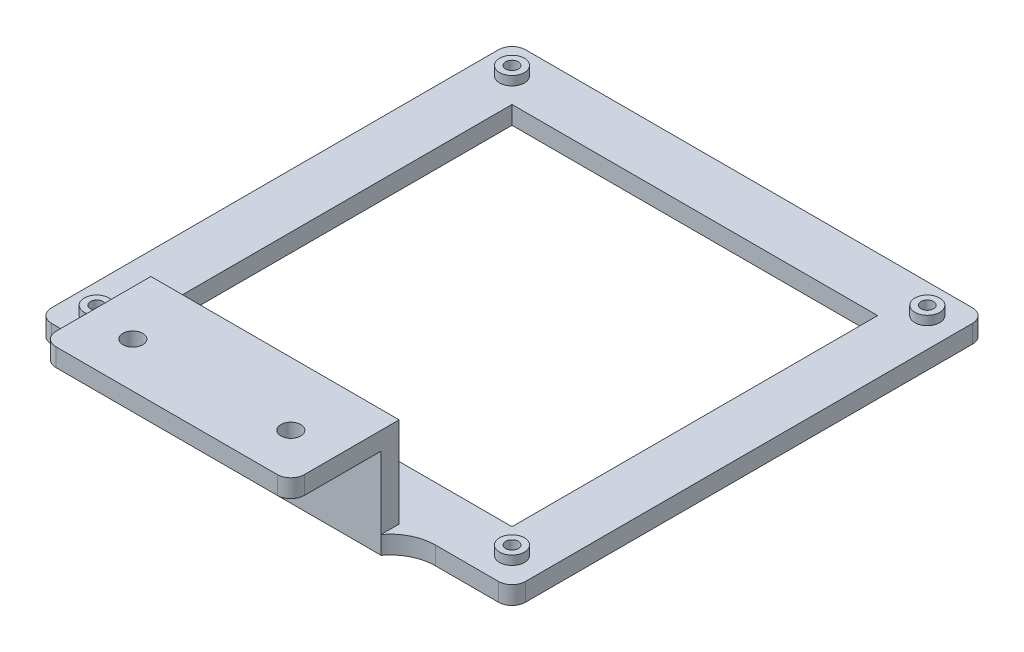
ISO-10303-21;
HEADER;
FILE_DESCRIPTION(('STEP AP214'),'2;1');
FILE_NAME('part.step','',(''),(''),'','','');
FILE_SCHEMA(('AUTOMOTIVE_DESIGN { 1 0 10303 214 1 1 1 1 }'));
ENDSEC;
DATA;
#1=APPLICATION_CONTEXT('core data for automotive mechanical design processes');
#2=APPLICATION_PROTOCOL_DEFINITION('international standard','automotive_design',2000,#1);
#3=PRODUCT_CONTEXT('',#1,'mechanical');
#4=PRODUCT('Part','Part','',(#3));
#5=PRODUCT_RELATED_PRODUCT_CATEGORY('part','',(#4));
#6=PRODUCT_DEFINITION_FORMATION('','',#4);
#7=PRODUCT_DEFINITION_CONTEXT('part definition',#1,'design');
#8=PRODUCT_DEFINITION('design','',#6,#7);
#9=PRODUCT_DEFINITION_SHAPE('','',#8);
#10=(LENGTH_UNIT() NAMED_UNIT(*) SI_UNIT(.MILLI.,.METRE.));
#11=(NAMED_UNIT(*) PLANE_ANGLE_UNIT() SI_UNIT($,.RADIAN.));
#12=(NAMED_UNIT(*) SI_UNIT($,.STERADIAN.) SOLID_ANGLE_UNIT());
#13=UNCERTAINTY_MEASURE_WITH_UNIT(LENGTH_MEASURE(1.E-05),#10,'distance_accuracy_value','');
#14=(GEOMETRIC_REPRESENTATION_CONTEXT(3) GLOBAL_UNCERTAINTY_ASSIGNED_CONTEXT((#13)) GLOBAL_UNIT_ASSIGNED_CONTEXT((#10,
#11,#12)) REPRESENTATION_CONTEXT('',''));
#15=CARTESIAN_POINT('',(0.,0.,0.));
#16=DIRECTION('',(0.,0.,1.));
#17=DIRECTION('',(1.,0.,0.));
#18=AXIS2_PLACEMENT_3D('',#15,#16,#17);
#19=CARTESIAN_POINT('',(0.,4.,52.5));
#20=DIRECTION('',(0.,0.,-1.));
#21=DIRECTION('',(-1.,0.,0.));
#22=AXIS2_PLACEMENT_3D('',#19,#20,#21);
#23=PLANE('',#22);
#24=DIRECTION('',(1.,0.,0.));
#25=VECTOR('',#24,1.);
#26=CARTESIAN_POINT('',(0.,0.,52.5));
#27=LINE('',#26,#25);
#28=CARTESIAN_POINT('',(-49.5,0.,52.5));
#29=VERTEX_POINT('',#28);
#30=CARTESIAN_POINT('',(-35.5,0.,52.5));
#31=VERTEX_POINT('',#30);
#32=EDGE_CURVE('E334',#29,#31,#27,.T.);
#33=ORIENTED_EDGE('',*,*,#32,.T.);
#34=DIRECTION('',(0.,1.,0.));
#35=VECTOR('',#34,1.);
#36=CARTESIAN_POINT('',(-35.5,4.,52.5));
#37=LINE('',#36,#35);
#38=CARTESIAN_POINT('',(-35.5,4.,52.5));
#39=VERTEX_POINT('',#38);
#40=EDGE_CURVE('E204',#31,#39,#37,.T.);
#41=ORIENTED_EDGE('',*,*,#40,.T.);
#42=DIRECTION('',(1.,0.,0.));
#43=VECTOR('',#42,1.);
#44=CARTESIAN_POINT('',(0.,4.,52.5));
#45=LINE('',#44,#43);
#46=CARTESIAN_POINT('',(-49.5,4.,52.5));
#47=VERTEX_POINT('',#46);
#48=EDGE_CURVE('E301',#47,#39,#45,.T.);
#49=ORIENTED_EDGE('',*,*,#48,.F.);
#50=DIRECTION('',(0.,-1.,0.));
#51=VECTOR('',#50,1.);
#52=CARTESIAN_POINT('',(-49.5,4.,52.5));
#53=LINE('',#52,#51);
#54=EDGE_CURVE('E385',#47,#29,#53,.T.);
#55=ORIENTED_EDGE('',*,*,#54,.T.);
#56=EDGE_LOOP('',(#33,#41,#49,#55));
#57=FACE_BOUND('',#56,.T.);
#58=ADVANCED_FACE('F37',(#57),#23,.F.);
#59=CARTESIAN_POINT('',(0.,4.,0.));
#60=DIRECTION('',(0.,1.,0.));
#61=DIRECTION('',(0.,0.,1.));
#62=AXIS2_PLACEMENT_3D('',#59,#60,#61);
#63=PLANE('',#62);
#64=CARTESIAN_POINT('',(-46.,4.,46.));
#65=DIRECTION('',(0.,1.,0.));
#66=DIRECTION('',(0.,0.,1.));
#67=AXIS2_PLACEMENT_3D('',#64,#65,#66);
#68=CIRCLE('',#67,2.75);
#69=CARTESIAN_POINT('',(-46.,4.,48.75));
#70=VERTEX_POINT('',#69);
#71=EDGE_CURVE('E607',#70,#70,#68,.T.);
#72=ORIENTED_EDGE('',*,*,#71,.F.);
#73=EDGE_LOOP('',(#72));
#74=FACE_BOUND('',#73,.T.);
#75=CARTESIAN_POINT('',(-46.,4.,-46.));
#76=DIRECTION('',(0.,1.,0.));
#77=DIRECTION('',(0.,0.,1.));
#78=AXIS2_PLACEMENT_3D('',#75,#76,#77);
#79=CIRCLE('',#78,2.75);
#80=CARTESIAN_POINT('',(-46.,4.,-43.25));
#81=VERTEX_POINT('',#80);
#82=EDGE_CURVE('E270',#81,#81,#79,.T.);
#83=ORIENTED_EDGE('',*,*,#82,.F.);
#84=EDGE_LOOP('',(#83));
#85=FACE_BOUND('',#84,.T.);
#86=DIRECTION('',(0.,0.,1.));
#87=VECTOR('',#86,1.);
#88=CARTESIAN_POINT('',(-40.5,4.,0.));
#89=LINE('',#88,#87);
#90=CARTESIAN_POINT('',(-40.5,4.,-40.5));
#91=VERTEX_POINT('',#90);
#92=CARTESIAN_POINT('',(-40.5,4.,40.5));
#93=VERTEX_POINT('',#92);
#94=EDGE_CURVE('E280',#91,#93,#89,.T.);
#95=ORIENTED_EDGE('',*,*,#94,.F.);
#96=DIRECTION('',(1.,0.,0.));
#97=VECTOR('',#96,1.);
#98=CARTESIAN_POINT('',(0.,4.,-40.5));
#99=LINE('',#98,#97);
#100=CARTESIAN_POINT('',(40.5,4.,-40.5));
#101=VERTEX_POINT('',#100);
#102=EDGE_CURVE('E283',#91,#101,#99,.T.);
#103=ORIENTED_EDGE('',*,*,#102,.T.);
#104=DIRECTION('',(0.,0.,1.));
#105=VECTOR('',#104,1.);
#106=CARTESIAN_POINT('',(40.5,4.,0.));
#107=LINE('',#106,#105);
#108=CARTESIAN_POINT('',(40.5,4.,40.5));
#109=VERTEX_POINT('',#108);
#110=EDGE_CURVE('E286',#101,#109,#107,.T.);
#111=ORIENTED_EDGE('',*,*,#110,.T.);
#112=DIRECTION('',(1.,0.,0.));
#113=VECTOR('',#112,1.);
#114=CARTESIAN_POINT('',(0.,4.,40.5));
#115=LINE('',#114,#113);
#116=EDGE_CURVE('E288',#93,#109,#115,.T.);
#117=ORIENTED_EDGE('',*,*,#116,.F.);
#118=EDGE_LOOP('',(#95,#103,#111,#117));
#119=FACE_BOUND('',#118,.T.);
#120=DIRECTION('',(1.,0.,0.));
#121=VECTOR('',#120,1.);
#122=CARTESIAN_POINT('',(0.,4.,-52.5));
#123=LINE('',#122,#121);
#124=CARTESIAN_POINT('',(-49.5,4.,-52.5));
#125=VERTEX_POINT('',#124);
#126=CARTESIAN_POINT('',(49.5,4.,-52.5));
#127=VERTEX_POINT('',#126);
#128=EDGE_CURVE('E294',#125,#127,#123,.T.);
#129=ORIENTED_EDGE('',*,*,#128,.F.);
#130=CARTESIAN_POINT('',(-49.5,4.,-49.5));
#131=DIRECTION('',(0.,1.,0.));
#132=DIRECTION('',(0.,0.,1.));
#133=AXIS2_PLACEMENT_3D('',#130,#131,#132);
#134=CIRCLE('',#133,3.);
#135=CARTESIAN_POINT('',(-52.5,4.,-49.5));
#136=VERTEX_POINT('',#135);
#137=EDGE_CURVE('E358',#125,#136,#134,.T.);
#138=ORIENTED_EDGE('',*,*,#137,.T.);
#139=DIRECTION('',(0.,0.,1.));
#140=VECTOR('',#139,1.);
#141=CARTESIAN_POINT('',(-52.5,4.,0.));
#142=LINE('',#141,#140);
#143=CARTESIAN_POINT('',(-52.5,4.,49.5));
#144=VERTEX_POINT('',#143);
#145=EDGE_CURVE('E297',#136,#144,#142,.T.);
#146=ORIENTED_EDGE('',*,*,#145,.T.);
#147=CARTESIAN_POINT('',(-49.5,4.,49.5));
#148=DIRECTION('',(0.,1.,0.));
#149=DIRECTION('',(0.,0.,1.));
#150=AXIS2_PLACEMENT_3D('',#147,#148,#149);
#151=CIRCLE('',#150,3.);
#152=EDGE_CURVE('E352',#144,#47,#151,.T.);
#153=ORIENTED_EDGE('',*,*,#152,.T.);
#154=ORIENTED_EDGE('',*,*,#48,.T.);
#155=CARTESIAN_POINT('',(-35.5,4.,62.5));
#156=DIRECTION('',(0.,1.,0.));
#157=DIRECTION('',(0.,0.,1.));
#158=AXIS2_PLACEMENT_3D('',#155,#156,#157);
#159=CIRCLE('',#158,10.);
#160=CARTESIAN_POINT('',(-27.5,4.,56.5));
#161=VERTEX_POINT('',#160);
#162=EDGE_CURVE('E11',#39,#161,#159,.F.);
#163=ORIENTED_EDGE('',*,*,#162,.T.);
#164=DIRECTION('',(0.,0.,1.));
#165=VECTOR('',#164,1.);
#166=CARTESIAN_POINT('',(-27.5,4.,0.));
#167=LINE('',#166,#165);
#168=CARTESIAN_POINT('',(-27.5,4.,52.5));
#169=VERTEX_POINT('',#168);
#170=EDGE_CURVE('E51',#169,#161,#167,.T.);
#171=ORIENTED_EDGE('',*,*,#170,.F.);
#172=CARTESIAN_POINT('',(27.5,4.,52.5));
#173=VERTEX_POINT('',#172);
#174=EDGE_CURVE('E305',#169,#173,#45,.T.);
#175=ORIENTED_EDGE('',*,*,#174,.T.);
#176=DIRECTION('',(0.,0.,-1.));
#177=VECTOR('',#176,1.);
#178=CARTESIAN_POINT('',(27.5,4.,0.));
#179=LINE('',#178,#177);
#180=CARTESIAN_POINT('',(27.5,4.,56.5));
#181=VERTEX_POINT('',#180);
#182=EDGE_CURVE('E391',#181,#173,#179,.T.);
#183=ORIENTED_EDGE('',*,*,#182,.F.);
#184=CARTESIAN_POINT('',(35.5,4.,62.5));
#185=DIRECTION('',(0.,1.,0.));
#186=DIRECTION('',(0.,0.,1.));
#187=AXIS2_PLACEMENT_3D('',#184,#185,#186);
#188=CIRCLE('',#187,10.);
#189=CARTESIAN_POINT('',(35.5,4.,52.5));
#190=VERTEX_POINT('',#189);
#191=EDGE_CURVE('E203',#181,#190,#188,.F.);
#192=ORIENTED_EDGE('',*,*,#191,.T.);
#193=CARTESIAN_POINT('',(49.5,4.,52.5));
#194=VERTEX_POINT('',#193);
#195=EDGE_CURVE('E300',#190,#194,#45,.T.);
#196=ORIENTED_EDGE('',*,*,#195,.T.);
#197=CARTESIAN_POINT('',(49.5,4.,49.5));
#198=DIRECTION('',(0.,1.,0.));
#199=DIRECTION('',(0.,0.,1.));
#200=AXIS2_PLACEMENT_3D('',#197,#198,#199);
#201=CIRCLE('',#200,3.);
#202=CARTESIAN_POINT('',(52.5,4.,49.5));
#203=VERTEX_POINT('',#202);
#204=EDGE_CURVE('E354',#194,#203,#201,.T.);
#205=ORIENTED_EDGE('',*,*,#204,.T.);
#206=DIRECTION('',(0.,0.,1.));
#207=VECTOR('',#206,1.);
#208=CARTESIAN_POINT('',(52.5,4.,0.));
#209=LINE('',#208,#207);
#210=CARTESIAN_POINT('',(52.5,4.,-49.5));
#211=VERTEX_POINT('',#210);
#212=EDGE_CURVE('E291',#211,#203,#209,.T.);
#213=ORIENTED_EDGE('',*,*,#212,.F.);
#214=CARTESIAN_POINT('',(49.5,4.,-49.5));
#215=DIRECTION('',(0.,1.,0.));
#216=DIRECTION('',(0.,0.,1.));
#217=AXIS2_PLACEMENT_3D('',#214,#215,#216);
#218=CIRCLE('',#217,3.);
#219=EDGE_CURVE('E356',#211,#127,#218,.T.);
#220=ORIENTED_EDGE('',*,*,#219,.T.);
#221=EDGE_LOOP('',(#129,#138,#146,#153,#154,#163,#171,#175,#183,#192,#196,#205,#213,#220));
#222=FACE_BOUND('',#221,.T.);
#223=CARTESIAN_POINT('',(46.,4.,-46.));
#224=DIRECTION('',(0.,1.,0.));
#225=DIRECTION('',(0.,0.,1.));
#226=AXIS2_PLACEMENT_3D('',#223,#224,#225);
#227=CIRCLE('',#226,2.75000000000005);
#228=CARTESIAN_POINT('',(46.,4.,-43.2499999999999));
#229=VERTEX_POINT('',#228);
#230=EDGE_CURVE('E609',#229,#229,#227,.T.);
#231=ORIENTED_EDGE('',*,*,#230,.F.);
#232=EDGE_LOOP('',(#231));
#233=FACE_BOUND('',#232,.T.);
#234=CARTESIAN_POINT('',(46.,4.,46.));
#235=DIRECTION('',(0.,1.,0.));
#236=DIRECTION('',(0.,0.,1.));
#237=AXIS2_PLACEMENT_3D('',#234,#235,#236);
#238=CIRCLE('',#237,2.75000000000005);
#239=CARTESIAN_POINT('',(46.,4.,48.75));
#240=VERTEX_POINT('',#239);
#241=EDGE_CURVE('E255',#240,#240,#238,.T.);
#242=ORIENTED_EDGE('',*,*,#241,.F.);
#243=EDGE_LOOP('',(#242));
#244=FACE_BOUND('',#243,.T.);
#245=ADVANCED_FACE('F399',(#74,#85,#119,#222,#233,#244),#63,.T.);
#246=CARTESIAN_POINT('',(52.5,4.,0.));
#247=DIRECTION('',(1.,0.,0.));
#248=DIRECTION('',(0.,0.,-1.));
#249=AXIS2_PLACEMENT_3D('',#246,#247,#248);
#250=PLANE('',#249);
#251=DIRECTION('',(0.,0.,1.));
#252=VECTOR('',#251,1.);
#253=CARTESIAN_POINT('',(52.5,0.,0.));
#254=LINE('',#253,#252);
#255=CARTESIAN_POINT('',(52.5,0.,-49.5));
#256=VERTEX_POINT('',#255);
#257=CARTESIAN_POINT('',(52.5,0.,49.5));
#258=VERTEX_POINT('',#257);
#259=EDGE_CURVE('E316',#256,#258,#254,.T.);
#260=ORIENTED_EDGE('',*,*,#259,.F.);
#261=DIRECTION('',(0.,-1.,0.));
#262=VECTOR('',#261,1.);
#263=CARTESIAN_POINT('',(52.5,4.,-49.5));
#264=LINE('',#263,#262);
#265=EDGE_CURVE('E363',#256,#211,#264,.F.);
#266=ORIENTED_EDGE('',*,*,#265,.T.);
#267=ORIENTED_EDGE('',*,*,#212,.T.);
#268=DIRECTION('',(0.,-1.,0.));
#269=VECTOR('',#268,1.);
#270=CARTESIAN_POINT('',(52.5,0.,49.5));
#271=LINE('',#270,#269);
#272=EDGE_CURVE('E360',#203,#258,#271,.T.);
#273=ORIENTED_EDGE('',*,*,#272,.T.);
#274=EDGE_LOOP('',(#260,#266,#267,#273));
#275=FACE_BOUND('',#274,.T.);
#276=ADVANCED_FACE('F456',(#275),#250,.T.);
#277=CARTESIAN_POINT('',(0.,4.,-52.5));
#278=DIRECTION('',(0.,0.,-1.));
#279=DIRECTION('',(-1.,0.,0.));
#280=AXIS2_PLACEMENT_3D('',#277,#278,#279);
#281=PLANE('',#280);
#282=DIRECTION('',(1.,0.,0.));
#283=VECTOR('',#282,1.);
#284=CARTESIAN_POINT('',(0.,0.,-52.5));
#285=LINE('',#284,#283);
#286=CARTESIAN_POINT('',(-49.5,0.,-52.5));
#287=VERTEX_POINT('',#286);
#288=CARTESIAN_POINT('',(49.5,0.,-52.5));
#289=VERTEX_POINT('',#288);
#290=EDGE_CURVE('E319',#287,#289,#285,.T.);
#291=ORIENTED_EDGE('',*,*,#290,.F.);
#292=DIRECTION('',(0.,-1.,0.));
#293=VECTOR('',#292,1.);
#294=CARTESIAN_POINT('',(-49.5,4.,-52.5));
#295=LINE('',#294,#293);
#296=EDGE_CURVE('E350',#287,#125,#295,.F.);
#297=ORIENTED_EDGE('',*,*,#296,.T.);
#298=ORIENTED_EDGE('',*,*,#128,.T.);
#299=DIRECTION('',(0.,-1.,0.));
#300=VECTOR('',#299,1.);
#301=CARTESIAN_POINT('',(49.5,4.,-52.5));
#302=LINE('',#301,#300);
#303=EDGE_CURVE('E347',#127,#289,#302,.T.);
#304=ORIENTED_EDGE('',*,*,#303,.T.);
#305=EDGE_LOOP('',(#291,#297,#298,#304));
#306=FACE_BOUND('',#305,.T.);
#307=ADVANCED_FACE('F592',(#306),#281,.T.);
#308=CARTESIAN_POINT('',(-52.5,4.,0.));
#309=DIRECTION('',(1.,0.,0.));
#310=DIRECTION('',(0.,0.,-1.));
#311=AXIS2_PLACEMENT_3D('',#308,#309,#310);
#312=PLANE('',#311);
#313=ORIENTED_EDGE('',*,*,#145,.F.);
#314=DIRECTION('',(0.,-1.,0.));
#315=VECTOR('',#314,1.);
#316=CARTESIAN_POINT('',(-52.5,0.,-49.5));
#317=LINE('',#316,#315);
#318=CARTESIAN_POINT('',(-52.5,0.,-49.5));
#319=VERTEX_POINT('',#318);
#320=EDGE_CURVE('E337',#136,#319,#317,.T.);
#321=ORIENTED_EDGE('',*,*,#320,.T.);
#322=DIRECTION('',(0.,0.,1.));
#323=VECTOR('',#322,1.);
#324=CARTESIAN_POINT('',(-52.5,0.,0.));
#325=LINE('',#324,#323);
#326=CARTESIAN_POINT('',(-52.5,0.,49.5));
#327=VERTEX_POINT('',#326);
#328=EDGE_CURVE('E322',#319,#327,#325,.T.);
#329=ORIENTED_EDGE('',*,*,#328,.T.);
#330=DIRECTION('',(0.,-1.,0.));
#331=VECTOR('',#330,1.);
#332=CARTESIAN_POINT('',(-52.5,4.,49.5));
#333=LINE('',#332,#331);
#334=EDGE_CURVE('E604',#327,#144,#333,.F.);
#335=ORIENTED_EDGE('',*,*,#334,.T.);
#336=EDGE_LOOP('',(#313,#321,#329,#335));
#337=FACE_BOUND('',#336,.T.);
#338=ADVANCED_FACE('F582',(#337),#312,.F.);
#339=CARTESIAN_POINT('',(-40.5,4.,0.));
#340=DIRECTION('',(1.,0.,0.));
#341=DIRECTION('',(0.,0.,-1.));
#342=AXIS2_PLACEMENT_3D('',#339,#340,#341);
#343=PLANE('',#342);
#344=DIRECTION('',(0.,0.,1.));
#345=VECTOR('',#344,1.);
#346=CARTESIAN_POINT('',(-40.5,0.,0.));
#347=LINE('',#346,#345);
#348=CARTESIAN_POINT('',(-40.5,0.,-40.5));
#349=VERTEX_POINT('',#348);
#350=CARTESIAN_POINT('',(-40.5,0.,40.5));
#351=VERTEX_POINT('',#350);
#352=EDGE_CURVE('E277',#349,#351,#347,.T.);
#353=ORIENTED_EDGE('',*,*,#352,.F.);
#354=DIRECTION('',(0.,-1.,0.));
#355=VECTOR('',#354,1.);
#356=CARTESIAN_POINT('',(-40.5,4.,-40.5));
#357=LINE('',#356,#355);
#358=EDGE_CURVE('E614',#91,#349,#357,.T.);
#359=ORIENTED_EDGE('',*,*,#358,.F.);
#360=ORIENTED_EDGE('',*,*,#94,.T.);
#361=DIRECTION('',(0.,-1.,0.));
#362=VECTOR('',#361,1.);
#363=CARTESIAN_POINT('',(-40.5,4.,40.5));
#364=LINE('',#363,#362);
#365=EDGE_CURVE('E304',#93,#351,#364,.T.);
#366=ORIENTED_EDGE('',*,*,#365,.T.);
#367=EDGE_LOOP('',(#353,#359,#360,#366));
#368=FACE_BOUND('',#367,.T.);
#369=ADVANCED_FACE('F578',(#368),#343,.T.);
#370=CARTESIAN_POINT('',(0.,4.,-40.5));
#371=DIRECTION('',(0.,0.,-1.));
#372=DIRECTION('',(-1.,0.,0.));
#373=AXIS2_PLACEMENT_3D('',#370,#371,#372);
#374=PLANE('',#373);
#375=DIRECTION('',(1.,0.,0.));
#376=VECTOR('',#375,1.);
#377=CARTESIAN_POINT('',(0.,0.,-40.5));
#378=LINE('',#377,#376);
#379=CARTESIAN_POINT('',(40.5,0.,-40.5));
#380=VERTEX_POINT('',#379);
#381=EDGE_CURVE('E308',#349,#380,#378,.T.);
#382=ORIENTED_EDGE('',*,*,#381,.T.);
#383=DIRECTION('',(0.,-1.,0.));
#384=VECTOR('',#383,1.);
#385=CARTESIAN_POINT('',(40.5,4.,-40.5));
#386=LINE('',#385,#384);
#387=EDGE_CURVE('E616',#101,#380,#386,.T.);
#388=ORIENTED_EDGE('',*,*,#387,.F.);
#389=ORIENTED_EDGE('',*,*,#102,.F.);
#390=ORIENTED_EDGE('',*,*,#358,.T.);
#391=EDGE_LOOP('',(#382,#388,#389,#390));
#392=FACE_BOUND('',#391,.T.);
#393=ADVANCED_FACE('F581',(#392),#374,.F.);
#394=CARTESIAN_POINT('',(40.5,4.,0.));
#395=DIRECTION('',(1.,0.,0.));
#396=DIRECTION('',(0.,0.,-1.));
#397=AXIS2_PLACEMENT_3D('',#394,#395,#396);
#398=PLANE('',#397);
#399=DIRECTION('',(0.,0.,1.));
#400=VECTOR('',#399,1.);
#401=CARTESIAN_POINT('',(40.5,0.,0.));
#402=LINE('',#401,#400);
#403=CARTESIAN_POINT('',(40.5,0.,40.5));
#404=VERTEX_POINT('',#403);
#405=EDGE_CURVE('E310',#380,#404,#402,.T.);
#406=ORIENTED_EDGE('',*,*,#405,.T.);
#407=DIRECTION('',(0.,-1.,0.));
#408=VECTOR('',#407,1.);
#409=CARTESIAN_POINT('',(40.5,4.,40.5));
#410=LINE('',#409,#408);
#411=EDGE_CURVE('E619',#109,#404,#410,.T.);
#412=ORIENTED_EDGE('',*,*,#411,.F.);
#413=ORIENTED_EDGE('',*,*,#110,.F.);
#414=ORIENTED_EDGE('',*,*,#387,.T.);
#415=EDGE_LOOP('',(#406,#412,#413,#414));
#416=FACE_BOUND('',#415,.T.);
#417=ADVANCED_FACE('F484',(#416),#398,.F.);
#418=CARTESIAN_POINT('',(-46.,4.,-46.));
#419=DIRECTION('',(0.,-1.,0.));
#420=DIRECTION('',(0.,0.,-1.));
#421=AXIS2_PLACEMENT_3D('',#418,#419,#420);
#422=CYLINDRICAL_SURFACE('',#421,1.4);
#423=CARTESIAN_POINT('',(-46.,0.,-46.));
#424=DIRECTION('',(0.,1.,0.));
#425=DIRECTION('',(0.,0.,1.));
#426=AXIS2_PLACEMENT_3D('',#423,#424,#425);
#427=CIRCLE('',#426,1.4);
#428=CARTESIAN_POINT('',(-46.,0.,-44.6));
#429=VERTEX_POINT('',#428);
#430=EDGE_CURVE('E624',#429,#429,#427,.T.);
#431=ORIENTED_EDGE('',*,*,#430,.F.);
#432=EDGE_LOOP('',(#431));
#433=FACE_BOUND('',#432,.T.);
#434=CARTESIAN_POINT('',(-46.,6.,-46.));
#435=DIRECTION('',(0.,1.,0.));
#436=DIRECTION('',(0.,0.,1.));
#437=AXIS2_PLACEMENT_3D('',#434,#435,#436);
#438=CIRCLE('',#437,1.4);
#439=CARTESIAN_POINT('',(-46.,6.,-44.6));
#440=VERTEX_POINT('',#439);
#441=EDGE_CURVE('E271',#440,#440,#438,.T.);
#442=ORIENTED_EDGE('',*,*,#441,.T.);
#443=EDGE_LOOP('',(#442));
#444=FACE_BOUND('',#443,.T.);
#445=ADVANCED_FACE('F476',(#433,#444),#422,.F.);
#446=CARTESIAN_POINT('',(46.,4.,46.));
#447=DIRECTION('',(0.,-1.,0.));
#448=DIRECTION('',(0.,0.,-1.));
#449=AXIS2_PLACEMENT_3D('',#446,#447,#448);
#450=CYLINDRICAL_SURFACE('',#449,1.4);
#451=CARTESIAN_POINT('',(46.,0.,46.));
#452=DIRECTION('',(0.,1.,0.));
#453=DIRECTION('',(0.,0.,1.));
#454=AXIS2_PLACEMENT_3D('',#451,#452,#453);
#455=CIRCLE('',#454,1.4);
#456=CARTESIAN_POINT('',(46.,0.,47.4));
#457=VERTEX_POINT('',#456);
#458=EDGE_CURVE('E626',#457,#457,#455,.T.);
#459=ORIENTED_EDGE('',*,*,#458,.F.);
#460=EDGE_LOOP('',(#459));
#461=FACE_BOUND('',#460,.T.);
#462=CARTESIAN_POINT('',(46.,6.,46.));
#463=DIRECTION('',(0.,1.,0.));
#464=DIRECTION('',(0.,0.,1.));
#465=AXIS2_PLACEMENT_3D('',#462,#463,#464);
#466=CIRCLE('',#465,1.4);
#467=CARTESIAN_POINT('',(46.,6.,47.4));
#468=VERTEX_POINT('',#467);
#469=EDGE_CURVE('E256',#468,#468,#466,.T.);
#470=ORIENTED_EDGE('',*,*,#469,.T.);
#471=EDGE_LOOP('',(#470));
#472=FACE_BOUND('',#471,.T.);
#473=ADVANCED_FACE('F471',(#461,#472),#450,.F.);
#474=CARTESIAN_POINT('',(-46.,4.,46.));
#475=DIRECTION('',(0.,-1.,0.));
#476=DIRECTION('',(0.,0.,-1.));
#477=AXIS2_PLACEMENT_3D('',#474,#475,#476);
#478=CYLINDRICAL_SURFACE('',#477,1.4);
#479=CARTESIAN_POINT('',(-46.,0.,46.));
#480=DIRECTION('',(0.,1.,0.));
#481=DIRECTION('',(0.,0.,1.));
#482=AXIS2_PLACEMENT_3D('',#479,#480,#481);
#483=CIRCLE('',#482,1.4);
#484=CARTESIAN_POINT('',(-46.,0.,47.4));
#485=VERTEX_POINT('',#484);
#486=EDGE_CURVE('E327',#485,#485,#483,.F.);
#487=ORIENTED_EDGE('',*,*,#486,.T.);
#488=EDGE_LOOP('',(#487));
#489=FACE_BOUND('',#488,.T.);
#490=CARTESIAN_POINT('',(-46.,6.,46.));
#491=DIRECTION('',(0.,1.,0.));
#492=DIRECTION('',(0.,0.,1.));
#493=AXIS2_PLACEMENT_3D('',#490,#491,#492);
#494=CIRCLE('',#493,1.4);
#495=CARTESIAN_POINT('',(-46.,6.,47.4));
#496=VERTEX_POINT('',#495);
#497=EDGE_CURVE('E252',#496,#496,#494,.F.);
#498=ORIENTED_EDGE('',*,*,#497,.F.);
#499=EDGE_LOOP('',(#498));
#500=FACE_BOUND('',#499,.T.);
#501=ADVANCED_FACE('F463',(#489,#500),#478,.F.);
#502=ORIENTED_EDGE('',*,*,#195,.F.);
#503=DIRECTION('',(0.,1.,0.));
#504=VECTOR('',#503,1.);
#505=CARTESIAN_POINT('',(35.5,4.,52.5));
#506=LINE('',#505,#504);
#507=CARTESIAN_POINT('',(35.5,0.,52.5));
#508=VERTEX_POINT('',#507);
#509=EDGE_CURVE('E387',#190,#508,#506,.F.);
#510=ORIENTED_EDGE('',*,*,#509,.T.);
#511=CARTESIAN_POINT('',(49.5,0.,52.5));
#512=VERTEX_POINT('',#511);
#513=EDGE_CURVE('E198',#508,#512,#27,.T.);
#514=ORIENTED_EDGE('',*,*,#513,.T.);
#515=DIRECTION('',(0.,-1.,0.));
#516=VECTOR('',#515,1.);
#517=CARTESIAN_POINT('',(49.5,4.,52.5));
#518=LINE('',#517,#516);
#519=EDGE_CURVE('E365',#512,#194,#518,.F.);
#520=ORIENTED_EDGE('',*,*,#519,.T.);
#521=EDGE_LOOP('',(#502,#510,#514,#520));
#522=FACE_BOUND('',#521,.T.);
#523=ADVANCED_FACE('F402',(#522),#23,.F.);
#524=CARTESIAN_POINT('',(0.,4.,40.5));
#525=DIRECTION('',(0.,0.,-1.));
#526=DIRECTION('',(-1.,0.,0.));
#527=AXIS2_PLACEMENT_3D('',#524,#525,#526);
#528=PLANE('',#527);
#529=DIRECTION('',(1.,0.,0.));
#530=VECTOR('',#529,1.);
#531=CARTESIAN_POINT('',(0.,0.,40.5));
#532=LINE('',#531,#530);
#533=EDGE_CURVE('E313',#351,#404,#532,.T.);
#534=ORIENTED_EDGE('',*,*,#533,.F.);
#535=ORIENTED_EDGE('',*,*,#365,.F.);
#536=ORIENTED_EDGE('',*,*,#116,.T.);
#537=ORIENTED_EDGE('',*,*,#411,.T.);
#538=EDGE_LOOP('',(#534,#535,#536,#537));
#539=FACE_BOUND('',#538,.T.);
#540=ADVANCED_FACE('F462',(#539),#528,.T.);
#541=CARTESIAN_POINT('',(46.,4.,-46.));
#542=DIRECTION('',(0.,-1.,0.));
#543=DIRECTION('',(0.,0.,-1.));
#544=AXIS2_PLACEMENT_3D('',#541,#542,#543);
#545=CYLINDRICAL_SURFACE('',#544,1.4);
#546=CARTESIAN_POINT('',(46.,0.,-46.));
#547=DIRECTION('',(0.,1.,0.));
#548=DIRECTION('',(0.,0.,1.));
#549=AXIS2_PLACEMENT_3D('',#546,#547,#548);
#550=CIRCLE('',#549,1.4);
#551=CARTESIAN_POINT('',(46.,0.,-44.6));
#552=VERTEX_POINT('',#551);
#553=EDGE_CURVE('E284',#552,#552,#550,.F.);
#554=ORIENTED_EDGE('',*,*,#553,.T.);
#555=EDGE_LOOP('',(#554));
#556=FACE_BOUND('',#555,.T.);
#557=CARTESIAN_POINT('',(46.,6.,-46.));
#558=DIRECTION('',(0.,1.,0.));
#559=DIRECTION('',(0.,0.,1.));
#560=AXIS2_PLACEMENT_3D('',#557,#558,#559);
#561=CIRCLE('',#560,1.4);
#562=CARTESIAN_POINT('',(46.,6.,-44.6));
#563=VERTEX_POINT('',#562);
#564=EDGE_CURVE('E267',#563,#563,#561,.F.);
#565=ORIENTED_EDGE('',*,*,#564,.F.);
#566=EDGE_LOOP('',(#565));
#567=FACE_BOUND('',#566,.T.);
#568=ADVANCED_FACE('F468',(#556,#567),#545,.F.);
#569=CARTESIAN_POINT('',(0.,0.,0.));
#570=DIRECTION('',(0.,1.,0.));
#571=DIRECTION('',(0.,0.,1.));
#572=AXIS2_PLACEMENT_3D('',#569,#570,#571);
#573=PLANE('',#572);
#574=ORIENTED_EDGE('',*,*,#352,.T.);
#575=ORIENTED_EDGE('',*,*,#533,.T.);
#576=ORIENTED_EDGE('',*,*,#405,.F.);
#577=ORIENTED_EDGE('',*,*,#381,.F.);
#578=EDGE_LOOP('',(#574,#575,#576,#577));
#579=FACE_BOUND('',#578,.T.);
#580=ORIENTED_EDGE('',*,*,#328,.F.);
#581=CARTESIAN_POINT('',(-49.5,0.,-49.5));
#582=DIRECTION('',(0.,1.,0.));
#583=DIRECTION('',(0.,0.,1.));
#584=AXIS2_PLACEMENT_3D('',#581,#582,#583);
#585=CIRCLE('',#584,3.);
#586=EDGE_CURVE('E345',#319,#287,#585,.F.);
#587=ORIENTED_EDGE('',*,*,#586,.T.);
#588=ORIENTED_EDGE('',*,*,#290,.T.);
#589=CARTESIAN_POINT('',(49.5,0.,-49.5));
#590=DIRECTION('',(0.,1.,0.));
#591=DIRECTION('',(0.,0.,1.));
#592=AXIS2_PLACEMENT_3D('',#589,#590,#591);
#593=CIRCLE('',#592,3.);
#594=EDGE_CURVE('E343',#289,#256,#593,.F.);
#595=ORIENTED_EDGE('',*,*,#594,.T.);
#596=ORIENTED_EDGE('',*,*,#259,.T.);
#597=CARTESIAN_POINT('',(49.5,0.,49.5));
#598=DIRECTION('',(0.,1.,0.));
#599=DIRECTION('',(0.,0.,1.));
#600=AXIS2_PLACEMENT_3D('',#597,#598,#599);
#601=CIRCLE('',#600,3.);
#602=EDGE_CURVE('E341',#258,#512,#601,.F.);
#603=ORIENTED_EDGE('',*,*,#602,.T.);
#604=ORIENTED_EDGE('',*,*,#513,.F.);
#605=CARTESIAN_POINT('',(35.5,0.,62.5));
#606=DIRECTION('',(0.,1.,0.));
#607=DIRECTION('',(0.,0.,1.));
#608=AXIS2_PLACEMENT_3D('',#605,#606,#607);
#609=CIRCLE('',#608,10.);
#610=CARTESIAN_POINT('',(27.5,0.,56.5));
#611=VERTEX_POINT('',#610);
#612=EDGE_CURVE('E190',#508,#611,#609,.T.);
#613=ORIENTED_EDGE('',*,*,#612,.T.);
#614=DIRECTION('',(-1.,0.,0.));
#615=VECTOR('',#614,1.);
#616=CARTESIAN_POINT('',(27.5,0.,56.5));
#617=LINE('',#616,#615);
#618=CARTESIAN_POINT('',(-27.5,0.,56.5));
#619=VERTEX_POINT('',#618);
#620=EDGE_CURVE('E195',#611,#619,#617,.T.);
#621=ORIENTED_EDGE('',*,*,#620,.T.);
#622=CARTESIAN_POINT('',(-35.5,0.,62.5));
#623=DIRECTION('',(0.,1.,0.));
#624=DIRECTION('',(0.,0.,1.));
#625=AXIS2_PLACEMENT_3D('',#622,#623,#624);
#626=CIRCLE('',#625,10.);
#627=EDGE_CURVE('E45',#619,#31,#626,.T.);
#628=ORIENTED_EDGE('',*,*,#627,.T.);
#629=ORIENTED_EDGE('',*,*,#32,.F.);
#630=CARTESIAN_POINT('',(-49.5,0.,49.5));
#631=DIRECTION('',(0.,1.,0.));
#632=DIRECTION('',(0.,0.,1.));
#633=AXIS2_PLACEMENT_3D('',#630,#631,#632);
#634=CIRCLE('',#633,3.);
#635=EDGE_CURVE('E339',#29,#327,#634,.F.);
#636=ORIENTED_EDGE('',*,*,#635,.T.);
#637=EDGE_LOOP('',(#580,#587,#588,#595,#596,#603,#604,#613,#621,#628,#629,#636));
#638=FACE_BOUND('',#637,.T.);
#639=ORIENTED_EDGE('',*,*,#486,.F.);
#640=EDGE_LOOP('',(#639));
#641=FACE_BOUND('',#640,.T.);
#642=ORIENTED_EDGE('',*,*,#458,.T.);
#643=EDGE_LOOP('',(#642));
#644=FACE_BOUND('',#643,.T.);
#645=ORIENTED_EDGE('',*,*,#430,.T.);
#646=EDGE_LOOP('',(#645));
#647=FACE_BOUND('',#646,.T.);
#648=ORIENTED_EDGE('',*,*,#553,.F.);
#649=EDGE_LOOP('',(#648));
#650=FACE_BOUND('',#649,.T.);
#651=ADVANCED_FACE('F193',(#579,#638,#641,#644,#647,#650),#573,.F.);
#652=CARTESIAN_POINT('',(-46.,6.,-46.));
#653=DIRECTION('',(0.,-1.,0.));
#654=DIRECTION('',(0.,0.,-1.));
#655=AXIS2_PLACEMENT_3D('',#652,#653,#654);
#656=CYLINDRICAL_SURFACE('',#655,2.75);
#657=CARTESIAN_POINT('',(-46.,6.,-46.));
#658=DIRECTION('',(0.,1.,0.));
#659=DIRECTION('',(0.,0.,1.));
#660=AXIS2_PLACEMENT_3D('',#657,#658,#659);
#661=CIRCLE('',#660,2.75);
#662=CARTESIAN_POINT('',(-46.,6.,-43.25));
#663=VERTEX_POINT('',#662);
#664=EDGE_CURVE('E274',#663,#663,#661,.T.);
#665=ORIENTED_EDGE('',*,*,#664,.F.);
#666=EDGE_LOOP('',(#665));
#667=FACE_BOUND('',#666,.T.);
#668=ORIENTED_EDGE('',*,*,#82,.T.);
#669=EDGE_LOOP('',(#668));
#670=FACE_BOUND('',#669,.T.);
#671=ADVANCED_FACE('F490',(#667,#670),#656,.T.);
#672=CARTESIAN_POINT('',(0.,6.,0.));
#673=DIRECTION('',(0.,1.,0.));
#674=DIRECTION('',(0.,0.,1.));
#675=AXIS2_PLACEMENT_3D('',#672,#673,#674);
#676=PLANE('',#675);
#677=ORIENTED_EDGE('',*,*,#441,.F.);
#678=EDGE_LOOP('',(#677));
#679=FACE_BOUND('',#678,.T.);
#680=ORIENTED_EDGE('',*,*,#664,.T.);
#681=EDGE_LOOP('',(#680));
#682=FACE_BOUND('',#681,.T.);
#683=ADVANCED_FACE('F495',(#679,#682),#676,.T.);
#684=CARTESIAN_POINT('',(46.,6.,-46.));
#685=DIRECTION('',(0.,-1.,0.));
#686=DIRECTION('',(0.,0.,-1.));
#687=AXIS2_PLACEMENT_3D('',#684,#685,#686);
#688=CYLINDRICAL_SURFACE('',#687,2.75000000000005);
#689=CARTESIAN_POINT('',(46.,6.,-46.));
#690=DIRECTION('',(0.,1.,0.));
#691=DIRECTION('',(0.,0.,1.));
#692=AXIS2_PLACEMENT_3D('',#689,#690,#691);
#693=CIRCLE('',#692,2.75000000000005);
#694=CARTESIAN_POINT('',(46.,6.,-43.2499999999999));
#695=VERTEX_POINT('',#694);
#696=EDGE_CURVE('E262',#695,#695,#693,.F.);
#697=ORIENTED_EDGE('',*,*,#696,.T.);
#698=EDGE_LOOP('',(#697));
#699=FACE_BOUND('',#698,.T.);
#700=ORIENTED_EDGE('',*,*,#230,.T.);
#701=EDGE_LOOP('',(#700));
#702=FACE_BOUND('',#701,.T.);
#703=ADVANCED_FACE('F499',(#699,#702),#688,.T.);
#704=CARTESIAN_POINT('',(0.,6.,0.));
#705=DIRECTION('',(0.,1.,0.));
#706=DIRECTION('',(0.,0.,1.));
#707=AXIS2_PLACEMENT_3D('',#704,#705,#706);
#708=PLANE('',#707);
#709=ORIENTED_EDGE('',*,*,#696,.F.);
#710=EDGE_LOOP('',(#709));
#711=FACE_BOUND('',#710,.T.);
#712=ORIENTED_EDGE('',*,*,#564,.T.);
#713=EDGE_LOOP('',(#712));
#714=FACE_BOUND('',#713,.T.);
#715=ADVANCED_FACE('F503',(#711,#714),#708,.T.);
#716=CARTESIAN_POINT('',(46.,6.,46.));
#717=DIRECTION('',(0.,-1.,0.));
#718=DIRECTION('',(0.,0.,-1.));
#719=AXIS2_PLACEMENT_3D('',#716,#717,#718);
#720=CYLINDRICAL_SURFACE('',#719,2.75000000000005);
#721=CARTESIAN_POINT('',(46.,6.,46.));
#722=DIRECTION('',(0.,1.,0.));
#723=DIRECTION('',(0.,0.,1.));
#724=AXIS2_PLACEMENT_3D('',#721,#722,#723);
#725=CIRCLE('',#724,2.75000000000005);
#726=CARTESIAN_POINT('',(46.,6.,48.75));
#727=VERTEX_POINT('',#726);
#728=EDGE_CURVE('E259',#727,#727,#725,.T.);
#729=ORIENTED_EDGE('',*,*,#728,.F.);
#730=EDGE_LOOP('',(#729));
#731=FACE_BOUND('',#730,.T.);
#732=ORIENTED_EDGE('',*,*,#241,.T.);
#733=EDGE_LOOP('',(#732));
#734=FACE_BOUND('',#733,.T.);
#735=ADVANCED_FACE('F507',(#731,#734),#720,.T.);
#736=CARTESIAN_POINT('',(0.,6.,0.));
#737=DIRECTION('',(0.,1.,0.));
#738=DIRECTION('',(0.,0.,1.));
#739=AXIS2_PLACEMENT_3D('',#736,#737,#738);
#740=PLANE('',#739);
#741=ORIENTED_EDGE('',*,*,#469,.F.);
#742=EDGE_LOOP('',(#741));
#743=FACE_BOUND('',#742,.T.);
#744=ORIENTED_EDGE('',*,*,#728,.T.);
#745=EDGE_LOOP('',(#744));
#746=FACE_BOUND('',#745,.T.);
#747=ADVANCED_FACE('F511',(#743,#746),#740,.T.);
#748=CARTESIAN_POINT('',(-46.,6.,46.));
#749=DIRECTION('',(0.,-1.,0.));
#750=DIRECTION('',(0.,0.,-1.));
#751=AXIS2_PLACEMENT_3D('',#748,#749,#750);
#752=CYLINDRICAL_SURFACE('',#751,2.75);
#753=CARTESIAN_POINT('',(-46.,6.,46.));
#754=DIRECTION('',(0.,1.,0.));
#755=DIRECTION('',(0.,0.,1.));
#756=AXIS2_PLACEMENT_3D('',#753,#754,#755);
#757=CIRCLE('',#756,2.75);
#758=CARTESIAN_POINT('',(-46.,6.,48.75));
#759=VERTEX_POINT('',#758);
#760=EDGE_CURVE('E241',#759,#759,#757,.F.);
#761=ORIENTED_EDGE('',*,*,#760,.T.);
#762=EDGE_LOOP('',(#761));
#763=FACE_BOUND('',#762,.T.);
#764=ORIENTED_EDGE('',*,*,#71,.T.);
#765=EDGE_LOOP('',(#764));
#766=FACE_BOUND('',#765,.T.);
#767=ADVANCED_FACE('F515',(#763,#766),#752,.T.);
#768=CARTESIAN_POINT('',(0.,6.,0.));
#769=DIRECTION('',(0.,1.,0.));
#770=DIRECTION('',(0.,0.,1.));
#771=AXIS2_PLACEMENT_3D('',#768,#769,#770);
#772=PLANE('',#771);
#773=ORIENTED_EDGE('',*,*,#760,.F.);
#774=EDGE_LOOP('',(#773));
#775=FACE_BOUND('',#774,.T.);
#776=ORIENTED_EDGE('',*,*,#497,.T.);
#777=EDGE_LOOP('',(#776));
#778=FACE_BOUND('',#777,.T.);
#779=ADVANCED_FACE('F519',(#775,#778),#772,.T.);
#780=CARTESIAN_POINT('',(27.5,24.,52.5));
#781=DIRECTION('',(0.,0.,-1.));
#782=DIRECTION('',(-1.,0.,0.));
#783=AXIS2_PLACEMENT_3D('',#780,#781,#782);
#784=PLANE('',#783);
#785=ORIENTED_EDGE('',*,*,#174,.F.);
#786=DIRECTION('',(0.,-1.,0.));
#787=VECTOR('',#786,1.);
#788=CARTESIAN_POINT('',(-27.5,24.,52.5));
#789=LINE('',#788,#787);
#790=CARTESIAN_POINT('',(-27.5,24.,52.5));
#791=VERTEX_POINT('',#790);
#792=EDGE_CURVE('E228',#791,#169,#789,.T.);
#793=ORIENTED_EDGE('',*,*,#792,.F.);
#794=DIRECTION('',(-1.,0.,0.));
#795=VECTOR('',#794,1.);
#796=CARTESIAN_POINT('',(27.5,24.,52.5));
#797=LINE('',#796,#795);
#798=CARTESIAN_POINT('',(27.5,24.,52.5));
#799=VERTEX_POINT('',#798);
#800=EDGE_CURVE('E238',#799,#791,#797,.T.);
#801=ORIENTED_EDGE('',*,*,#800,.F.);
#802=DIRECTION('',(0.,-1.,0.));
#803=VECTOR('',#802,1.);
#804=CARTESIAN_POINT('',(27.5,24.,52.5));
#805=LINE('',#804,#803);
#806=EDGE_CURVE('E223',#799,#173,#805,.T.);
#807=ORIENTED_EDGE('',*,*,#806,.T.);
#808=EDGE_LOOP('',(#785,#793,#801,#807));
#809=FACE_BOUND('',#808,.T.);
#810=ADVANCED_FACE('F409',(#809),#784,.T.);
#811=CARTESIAN_POINT('',(27.5,24.,76.5));
#812=DIRECTION('',(0.,1.,0.));
#813=DIRECTION('',(0.,0.,1.));
#814=AXIS2_PLACEMENT_3D('',#811,#812,#813);
#815=PLANE('',#814);
#816=CARTESIAN_POINT('',(-17.5,24.,66.5));
#817=DIRECTION('',(0.,1.,0.));
#818=DIRECTION('',(0.,0.,1.));
#819=AXIS2_PLACEMENT_3D('',#816,#817,#818);
#820=CIRCLE('',#819,2.19999999999999);
#821=CARTESIAN_POINT('',(-17.5,24.,68.7));
#822=VERTEX_POINT('',#821);
#823=EDGE_CURVE('E559',#822,#822,#820,.T.);
#824=ORIENTED_EDGE('',*,*,#823,.F.);
#825=EDGE_LOOP('',(#824));
#826=FACE_BOUND('',#825,.T.);
#827=CARTESIAN_POINT('',(17.5,24.,66.5));
#828=DIRECTION('',(0.,1.,0.));
#829=DIRECTION('',(0.,0.,1.));
#830=AXIS2_PLACEMENT_3D('',#827,#828,#829);
#831=CIRCLE('',#830,2.2);
#832=CARTESIAN_POINT('',(17.5,24.,68.7));
#833=VERTEX_POINT('',#832);
#834=EDGE_CURVE('E231',#833,#833,#831,.T.);
#835=ORIENTED_EDGE('',*,*,#834,.F.);
#836=EDGE_LOOP('',(#835));
#837=FACE_BOUND('',#836,.T.);
#838=DIRECTION('',(-1.,0.,0.));
#839=VECTOR('',#838,1.);
#840=CARTESIAN_POINT('',(27.5,24.,76.5));
#841=LINE('',#840,#839);
#842=CARTESIAN_POINT('',(24.5,24.,76.5));
#843=VERTEX_POINT('',#842);
#844=CARTESIAN_POINT('',(-24.5,24.,76.5));
#845=VERTEX_POINT('',#844);
#846=EDGE_CURVE('E242',#843,#845,#841,.T.);
#847=ORIENTED_EDGE('',*,*,#846,.F.);
#848=CARTESIAN_POINT('',(24.5,24.,73.5));
#849=DIRECTION('',(0.,1.,0.));
#850=DIRECTION('',(0.,0.,1.));
#851=AXIS2_PLACEMENT_3D('',#848,#849,#850);
#852=CIRCLE('',#851,3.);
#853=CARTESIAN_POINT('',(27.5,24.,73.5));
#854=VERTEX_POINT('',#853);
#855=EDGE_CURVE('E375',#843,#854,#852,.T.);
#856=ORIENTED_EDGE('',*,*,#855,.T.);
#857=DIRECTION('',(0.,0.,-1.));
#858=VECTOR('',#857,1.);
#859=CARTESIAN_POINT('',(27.5,24.,76.5));
#860=LINE('',#859,#858);
#861=EDGE_CURVE('E215',#854,#799,#860,.T.);
#862=ORIENTED_EDGE('',*,*,#861,.T.);
#863=ORIENTED_EDGE('',*,*,#800,.T.);
#864=DIRECTION('',(0.,0.,-1.));
#865=VECTOR('',#864,1.);
#866=CARTESIAN_POINT('',(-27.5,24.,76.5));
#867=LINE('',#866,#865);
#868=CARTESIAN_POINT('',(-27.5,24.,73.5));
#869=VERTEX_POINT('',#868);
#870=EDGE_CURVE('E236',#869,#791,#867,.T.);
#871=ORIENTED_EDGE('',*,*,#870,.F.);
#872=CARTESIAN_POINT('',(-24.5,24.,73.5));
#873=DIRECTION('',(0.,1.,0.));
#874=DIRECTION('',(0.,0.,1.));
#875=AXIS2_PLACEMENT_3D('',#872,#873,#874);
#876=CIRCLE('',#875,3.);
#877=EDGE_CURVE('E373',#869,#845,#876,.T.);
#878=ORIENTED_EDGE('',*,*,#877,.T.);
#879=EDGE_LOOP('',(#847,#856,#862,#863,#871,#878));
#880=FACE_BOUND('',#879,.T.);
#881=ADVANCED_FACE('F432',(#826,#837,#880),#815,.T.);
#882=CARTESIAN_POINT('',(27.5,20.,76.5));
#883=DIRECTION('',(0.,0.,1.));
#884=DIRECTION('',(1.,0.,0.));
#885=AXIS2_PLACEMENT_3D('',#882,#883,#884);
#886=PLANE('',#885);
#887=DIRECTION('',(-1.,0.,0.));
#888=VECTOR('',#887,1.);
#889=CARTESIAN_POINT('',(27.5,20.,76.5));
#890=LINE('',#889,#888);
#891=CARTESIAN_POINT('',(24.5,20.,76.5));
#892=VERTEX_POINT('',#891);
#893=CARTESIAN_POINT('',(-24.5,20.,76.5));
#894=VERTEX_POINT('',#893);
#895=EDGE_CURVE('E245',#892,#894,#890,.T.);
#896=ORIENTED_EDGE('',*,*,#895,.F.);
#897=DIRECTION('',(0.,1.,0.));
#898=VECTOR('',#897,1.);
#899=CARTESIAN_POINT('',(24.5,24.,76.5));
#900=LINE('',#899,#898);
#901=EDGE_CURVE('E370',#892,#843,#900,.T.);
#902=ORIENTED_EDGE('',*,*,#901,.T.);
#903=ORIENTED_EDGE('',*,*,#846,.T.);
#904=DIRECTION('',(0.,1.,0.));
#905=VECTOR('',#904,1.);
#906=CARTESIAN_POINT('',(-24.5,20.,76.5));
#907=LINE('',#906,#905);
#908=EDGE_CURVE('E368',#845,#894,#907,.F.);
#909=ORIENTED_EDGE('',*,*,#908,.T.);
#910=EDGE_LOOP('',(#896,#902,#903,#909));
#911=FACE_BOUND('',#910,.T.);
#912=ADVANCED_FACE('F435',(#911),#886,.T.);
#913=CARTESIAN_POINT('',(27.5,20.,56.5));
#914=DIRECTION('',(0.,-1.,0.));
#915=DIRECTION('',(0.,0.,-1.));
#916=AXIS2_PLACEMENT_3D('',#913,#914,#915);
#917=PLANE('',#916);
#918=CARTESIAN_POINT('',(-17.5,20.,66.5));
#919=DIRECTION('',(0.,-1.,0.));
#920=DIRECTION('',(0.,0.,-1.));
#921=AXIS2_PLACEMENT_3D('',#918,#919,#920);
#922=CIRCLE('',#921,2.19999999999999);
#923=CARTESIAN_POINT('',(-17.5,20.,64.3));
#924=VERTEX_POINT('',#923);
#925=EDGE_CURVE('E556',#924,#924,#922,.F.);
#926=ORIENTED_EDGE('',*,*,#925,.T.);
#927=EDGE_LOOP('',(#926));
#928=FACE_BOUND('',#927,.T.);
#929=CARTESIAN_POINT('',(17.5,20.,66.5));
#930=DIRECTION('',(0.,-1.,0.));
#931=DIRECTION('',(0.,0.,-1.));
#932=AXIS2_PLACEMENT_3D('',#929,#930,#931);
#933=CIRCLE('',#932,2.2);
#934=CARTESIAN_POINT('',(17.5,20.,64.3));
#935=VERTEX_POINT('',#934);
#936=EDGE_CURVE('E560',#935,#935,#933,.F.);
#937=ORIENTED_EDGE('',*,*,#936,.T.);
#938=EDGE_LOOP('',(#937));
#939=FACE_BOUND('',#938,.T.);
#940=DIRECTION('',(0.,0.,1.));
#941=VECTOR('',#940,1.);
#942=CARTESIAN_POINT('',(27.5,20.,56.5));
#943=LINE('',#942,#941);
#944=CARTESIAN_POINT('',(27.5,20.,56.5));
#945=VERTEX_POINT('',#944);
#946=CARTESIAN_POINT('',(27.5,20.,73.5));
#947=VERTEX_POINT('',#946);
#948=EDGE_CURVE('E218',#945,#947,#943,.T.);
#949=ORIENTED_EDGE('',*,*,#948,.T.);
#950=CARTESIAN_POINT('',(24.5,20.,73.5));
#951=DIRECTION('',(0.,-1.,0.));
#952=DIRECTION('',(0.,0.,-1.));
#953=AXIS2_PLACEMENT_3D('',#950,#951,#952);
#954=CIRCLE('',#953,3.);
#955=EDGE_CURVE('E381',#947,#892,#954,.T.);
#956=ORIENTED_EDGE('',*,*,#955,.T.);
#957=ORIENTED_EDGE('',*,*,#895,.T.);
#958=CARTESIAN_POINT('',(-24.5,20.,73.5));
#959=DIRECTION('',(0.,-1.,0.));
#960=DIRECTION('',(0.,0.,-1.));
#961=AXIS2_PLACEMENT_3D('',#958,#959,#960);
#962=CIRCLE('',#961,3.);
#963=CARTESIAN_POINT('',(-27.5,20.,73.5));
#964=VERTEX_POINT('',#963);
#965=EDGE_CURVE('E379',#894,#964,#962,.T.);
#966=ORIENTED_EDGE('',*,*,#965,.T.);
#967=DIRECTION('',(0.,0.,1.));
#968=VECTOR('',#967,1.);
#969=CARTESIAN_POINT('',(-27.5,20.,56.5));
#970=LINE('',#969,#968);
#971=CARTESIAN_POINT('',(-27.5,20.,56.5));
#972=VERTEX_POINT('',#971);
#973=EDGE_CURVE('E233',#972,#964,#970,.T.);
#974=ORIENTED_EDGE('',*,*,#973,.F.);
#975=DIRECTION('',(-1.,0.,0.));
#976=VECTOR('',#975,1.);
#977=CARTESIAN_POINT('',(27.5,20.,56.5));
#978=LINE('',#977,#976);
#979=EDGE_CURVE('E214',#945,#972,#978,.T.);
#980=ORIENTED_EDGE('',*,*,#979,.F.);
#981=EDGE_LOOP('',(#949,#956,#957,#966,#974,#980));
#982=FACE_BOUND('',#981,.T.);
#983=ADVANCED_FACE('F420',(#928,#939,#982),#917,.T.);
#984=CARTESIAN_POINT('',(27.5,0.,56.5));
#985=DIRECTION('',(0.,0.,1.));
#986=DIRECTION('',(1.,0.,0.));
#987=AXIS2_PLACEMENT_3D('',#984,#985,#986);
#988=PLANE('',#987);
#989=DIRECTION('',(0.,1.,0.));
#990=VECTOR('',#989,1.);
#991=CARTESIAN_POINT('',(-27.5,0.,56.5));
#992=LINE('',#991,#990);
#993=EDGE_CURVE('E213',#619,#161,#992,.T.);
#994=ORIENTED_EDGE('',*,*,#993,.F.);
#995=ORIENTED_EDGE('',*,*,#620,.F.);
#996=DIRECTION('',(0.,1.,0.));
#997=VECTOR('',#996,1.);
#998=CARTESIAN_POINT('',(27.5,0.,56.5));
#999=LINE('',#998,#997);
#1000=EDGE_CURVE('E209',#611,#181,#999,.T.);
#1001=ORIENTED_EDGE('',*,*,#1000,.T.);
#1002=EDGE_CURVE('E219',#181,#945,#999,.T.);
#1003=ORIENTED_EDGE('',*,*,#1002,.T.);
#1004=ORIENTED_EDGE('',*,*,#979,.T.);
#1005=EDGE_CURVE('E230',#161,#972,#992,.T.);
#1006=ORIENTED_EDGE('',*,*,#1005,.F.);
#1007=EDGE_LOOP('',(#994,#995,#1001,#1003,#1004,#1006));
#1008=FACE_BOUND('',#1007,.T.);
#1009=ADVANCED_FACE('F208',(#1008),#988,.T.);
#1010=CARTESIAN_POINT('',(27.5,0.,0.));
#1011=DIRECTION('',(-1.,0.,0.));
#1012=DIRECTION('',(0.,0.,1.));
#1013=AXIS2_PLACEMENT_3D('',#1010,#1011,#1012);
#1014=PLANE('',#1013);
#1015=ORIENTED_EDGE('',*,*,#1002,.F.);
#1016=ORIENTED_EDGE('',*,*,#182,.T.);
#1017=ORIENTED_EDGE('',*,*,#806,.F.);
#1018=ORIENTED_EDGE('',*,*,#861,.F.);
#1019=DIRECTION('',(0.,1.,0.));
#1020=VECTOR('',#1019,1.);
#1021=CARTESIAN_POINT('',(27.5,20.,73.5));
#1022=LINE('',#1021,#1020);
#1023=EDGE_CURVE('E377',#854,#947,#1022,.F.);
#1024=ORIENTED_EDGE('',*,*,#1023,.T.);
#1025=ORIENTED_EDGE('',*,*,#948,.F.);
#1026=EDGE_LOOP('',(#1015,#1016,#1017,#1018,#1024,#1025));
#1027=FACE_BOUND('',#1026,.T.);
#1028=ADVANCED_FACE('F414',(#1027),#1014,.F.);
#1029=CARTESIAN_POINT('',(-27.5,0.,0.));
#1030=DIRECTION('',(-1.,0.,0.));
#1031=DIRECTION('',(0.,0.,1.));
#1032=AXIS2_PLACEMENT_3D('',#1029,#1030,#1031);
#1033=PLANE('',#1032);
#1034=ORIENTED_EDGE('',*,*,#792,.T.);
#1035=ORIENTED_EDGE('',*,*,#170,.T.);
#1036=ORIENTED_EDGE('',*,*,#1005,.T.);
#1037=ORIENTED_EDGE('',*,*,#973,.T.);
#1038=DIRECTION('',(0.,1.,0.));
#1039=VECTOR('',#1038,1.);
#1040=CARTESIAN_POINT('',(-27.5,0.,73.5));
#1041=LINE('',#1040,#1039);
#1042=EDGE_CURVE('E383',#964,#869,#1041,.T.);
#1043=ORIENTED_EDGE('',*,*,#1042,.T.);
#1044=ORIENTED_EDGE('',*,*,#870,.T.);
#1045=EDGE_LOOP('',(#1034,#1035,#1036,#1037,#1043,#1044));
#1046=FACE_BOUND('',#1045,.T.);
#1047=ADVANCED_FACE('F425',(#1046),#1033,.T.);
#1048=CARTESIAN_POINT('',(17.5,-0.00104999999999897,66.5));
#1049=DIRECTION('',(0.,1.,0.));
#1050=DIRECTION('',(0.,0.,1.));
#1051=AXIS2_PLACEMENT_3D('',#1048,#1049,#1050);
#1052=CYLINDRICAL_SURFACE('',#1051,2.2);
#1053=ORIENTED_EDGE('',*,*,#936,.F.);
#1054=EDGE_LOOP('',(#1053));
#1055=FACE_BOUND('',#1054,.T.);
#1056=ORIENTED_EDGE('',*,*,#834,.T.);
#1057=EDGE_LOOP('',(#1056));
#1058=FACE_BOUND('',#1057,.T.);
#1059=ADVANCED_FACE('F538',(#1055,#1058),#1052,.F.);
#1060=CARTESIAN_POINT('',(-17.5,-0.00104999999999897,66.5));
#1061=DIRECTION('',(0.,1.,0.));
#1062=DIRECTION('',(0.,0.,1.));
#1063=AXIS2_PLACEMENT_3D('',#1060,#1061,#1062);
#1064=CYLINDRICAL_SURFACE('',#1063,2.19999999999999);
#1065=ORIENTED_EDGE('',*,*,#925,.F.);
#1066=EDGE_LOOP('',(#1065));
#1067=FACE_BOUND('',#1066,.T.);
#1068=ORIENTED_EDGE('',*,*,#823,.T.);
#1069=EDGE_LOOP('',(#1068));
#1070=FACE_BOUND('',#1069,.T.);
#1071=ADVANCED_FACE('F543',(#1067,#1070),#1064,.F.);
#1072=CARTESIAN_POINT('',(-49.5,4.,-49.5));
#1073=DIRECTION('',(0.,1.,0.));
#1074=DIRECTION('',(0.,0.,1.));
#1075=AXIS2_PLACEMENT_3D('',#1072,#1073,#1074);
#1076=CYLINDRICAL_SURFACE('',#1075,3.);
#1077=ORIENTED_EDGE('',*,*,#137,.F.);
#1078=ORIENTED_EDGE('',*,*,#296,.F.);
#1079=ORIENTED_EDGE('',*,*,#586,.F.);
#1080=ORIENTED_EDGE('',*,*,#320,.F.);
#1081=EDGE_LOOP('',(#1077,#1078,#1079,#1080));
#1082=FACE_BOUND('',#1081,.T.);
#1083=ADVANCED_FACE('F546',(#1082),#1076,.T.);
#1084=CARTESIAN_POINT('',(49.5,4.,-49.5));
#1085=DIRECTION('',(0.,-1.,0.));
#1086=DIRECTION('',(0.,0.,-1.));
#1087=AXIS2_PLACEMENT_3D('',#1084,#1085,#1086);
#1088=CYLINDRICAL_SURFACE('',#1087,3.);
#1089=ORIENTED_EDGE('',*,*,#219,.F.);
#1090=ORIENTED_EDGE('',*,*,#265,.F.);
#1091=ORIENTED_EDGE('',*,*,#594,.F.);
#1092=ORIENTED_EDGE('',*,*,#303,.F.);
#1093=EDGE_LOOP('',(#1089,#1090,#1091,#1092));
#1094=FACE_BOUND('',#1093,.T.);
#1095=ADVANCED_FACE('F448',(#1094),#1088,.T.);
#1096=CARTESIAN_POINT('',(49.5,4.,49.5));
#1097=DIRECTION('',(0.,1.,0.));
#1098=DIRECTION('',(0.,0.,1.));
#1099=AXIS2_PLACEMENT_3D('',#1096,#1097,#1098);
#1100=CYLINDRICAL_SURFACE('',#1099,3.);
#1101=ORIENTED_EDGE('',*,*,#204,.F.);
#1102=ORIENTED_EDGE('',*,*,#519,.F.);
#1103=ORIENTED_EDGE('',*,*,#602,.F.);
#1104=ORIENTED_EDGE('',*,*,#272,.F.);
#1105=EDGE_LOOP('',(#1101,#1102,#1103,#1104));
#1106=FACE_BOUND('',#1105,.T.);
#1107=ADVANCED_FACE('F440',(#1106),#1100,.T.);
#1108=CARTESIAN_POINT('',(24.5,20.,73.5));
#1109=DIRECTION('',(0.,-1.,0.));
#1110=DIRECTION('',(0.,0.,-1.));
#1111=AXIS2_PLACEMENT_3D('',#1108,#1109,#1110);
#1112=CYLINDRICAL_SURFACE('',#1111,3.);
#1113=ORIENTED_EDGE('',*,*,#955,.F.);
#1114=ORIENTED_EDGE('',*,*,#1023,.F.);
#1115=ORIENTED_EDGE('',*,*,#855,.F.);
#1116=ORIENTED_EDGE('',*,*,#901,.F.);
#1117=EDGE_LOOP('',(#1113,#1114,#1115,#1116));
#1118=FACE_BOUND('',#1117,.T.);
#1119=ADVANCED_FACE('F438',(#1118),#1112,.T.);
#1120=CARTESIAN_POINT('',(-24.5,0.,73.5));
#1121=DIRECTION('',(0.,1.,0.));
#1122=DIRECTION('',(0.,0.,1.));
#1123=AXIS2_PLACEMENT_3D('',#1120,#1121,#1122);
#1124=CYLINDRICAL_SURFACE('',#1123,3.);
#1125=ORIENTED_EDGE('',*,*,#965,.F.);
#1126=ORIENTED_EDGE('',*,*,#908,.F.);
#1127=ORIENTED_EDGE('',*,*,#877,.F.);
#1128=ORIENTED_EDGE('',*,*,#1042,.F.);
#1129=EDGE_LOOP('',(#1125,#1126,#1127,#1128));
#1130=FACE_BOUND('',#1129,.T.);
#1131=ADVANCED_FACE('F428',(#1130),#1124,.T.);
#1132=CARTESIAN_POINT('',(-49.5,4.,49.5));
#1133=DIRECTION('',(0.,-1.,0.));
#1134=DIRECTION('',(0.,0.,-1.));
#1135=AXIS2_PLACEMENT_3D('',#1132,#1133,#1134);
#1136=CYLINDRICAL_SURFACE('',#1135,3.);
#1137=ORIENTED_EDGE('',*,*,#152,.F.);
#1138=ORIENTED_EDGE('',*,*,#334,.F.);
#1139=ORIENTED_EDGE('',*,*,#635,.F.);
#1140=ORIENTED_EDGE('',*,*,#54,.F.);
#1141=EDGE_LOOP('',(#1137,#1138,#1139,#1140));
#1142=FACE_BOUND('',#1141,.T.);
#1143=ADVANCED_FACE('F446',(#1142),#1136,.T.);
#1144=CARTESIAN_POINT('',(35.5,0.,62.5));
#1145=DIRECTION('',(0.,1.,0.));
#1146=DIRECTION('',(0.,0.,1.));
#1147=AXIS2_PLACEMENT_3D('',#1144,#1145,#1146);
#1148=CYLINDRICAL_SURFACE('',#1147,10.);
#1149=ORIENTED_EDGE('',*,*,#191,.F.);
#1150=ORIENTED_EDGE('',*,*,#1000,.F.);
#1151=ORIENTED_EDGE('',*,*,#612,.F.);
#1152=ORIENTED_EDGE('',*,*,#509,.F.);
#1153=EDGE_LOOP('',(#1149,#1150,#1151,#1152));
#1154=FACE_BOUND('',#1153,.T.);
#1155=ADVANCED_FACE('F217',(#1154),#1148,.F.);
#1156=CARTESIAN_POINT('',(-35.5,0.,62.5));
#1157=DIRECTION('',(0.,1.,0.));
#1158=DIRECTION('',(0.,0.,1.));
#1159=AXIS2_PLACEMENT_3D('',#1156,#1157,#1158);
#1160=CYLINDRICAL_SURFACE('',#1159,10.);
#1161=ORIENTED_EDGE('',*,*,#162,.F.);
#1162=ORIENTED_EDGE('',*,*,#40,.F.);
#1163=ORIENTED_EDGE('',*,*,#627,.F.);
#1164=ORIENTED_EDGE('',*,*,#993,.T.);
#1165=EDGE_LOOP('',(#1161,#1162,#1163,#1164));
#1166=FACE_BOUND('',#1165,.T.);
#1167=ADVANCED_FACE('F39',(#1166),#1160,.F.);
#1168=CLOSED_SHELL('',(#58,#245,#276,#307,#338,#369,#393,#417,#445,#473,#501,#523,#540,#568,
#651,#671,#683,#703,#715,#735,#747,#767,#779,#810,#881,#912,#983,#1009,#1028,#1047,#1059,#1071,
#1083,#1095,#1107,#1119,#1131,#1143,#1155,#1167));
#1169=MANIFOLD_SOLID_BREP('B2',#1168);
#1170=ADVANCED_BREP_SHAPE_REPRESENTATION('',(#18,#1169),#14);
#1171=SHAPE_DEFINITION_REPRESENTATION(#9,#1170);
ENDSEC;
END-ISO-10303-21;
